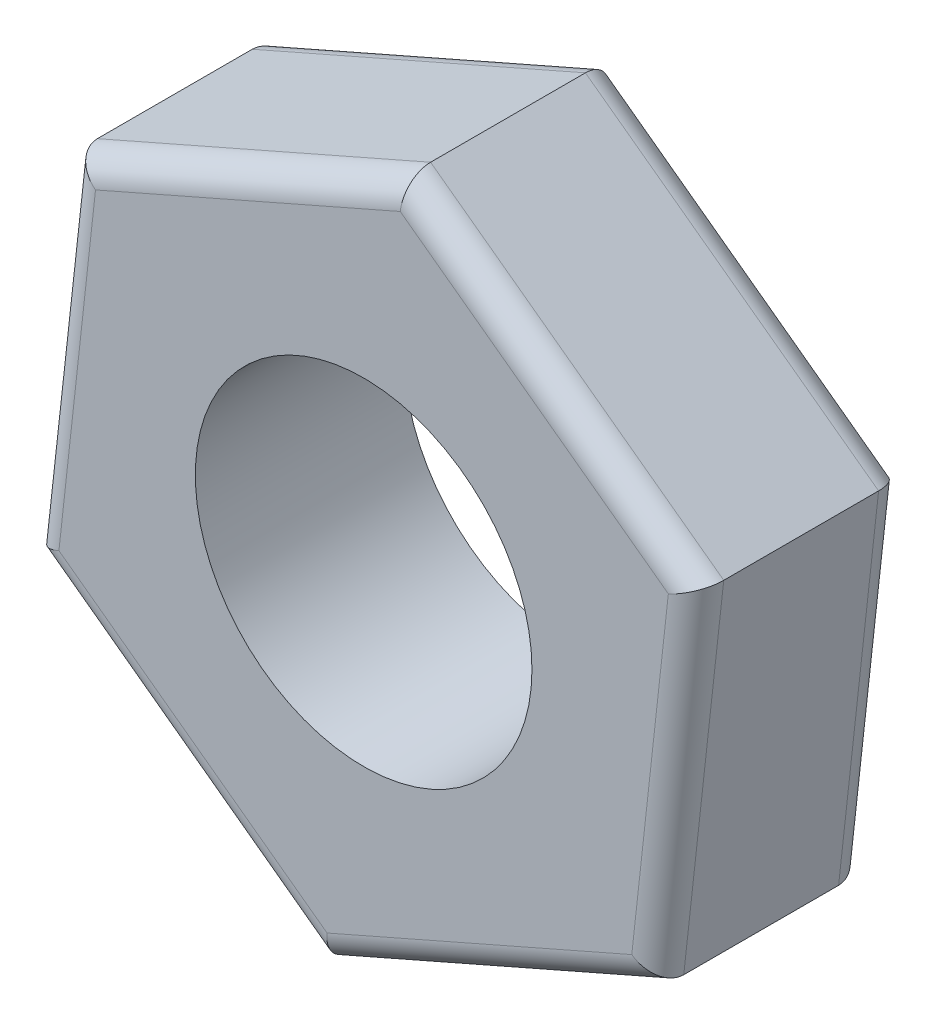
ISO-10303-21;
HEADER;
FILE_DESCRIPTION(('STEP AP214'),'2;1');
FILE_NAME('part.step','',(''),(''),'','','');
FILE_SCHEMA(('AUTOMOTIVE_DESIGN { 1 0 10303 214 1 1 1 1 }'));
ENDSEC;
DATA;
#1=APPLICATION_CONTEXT('core data for automotive mechanical design processes');
#2=APPLICATION_PROTOCOL_DEFINITION('international standard','automotive_design',2000,#1);
#3=PRODUCT_CONTEXT('',#1,'mechanical');
#4=PRODUCT('Part','Part','',(#3));
#5=PRODUCT_RELATED_PRODUCT_CATEGORY('part','',(#4));
#6=PRODUCT_DEFINITION_FORMATION('','',#4);
#7=PRODUCT_DEFINITION_CONTEXT('part definition',#1,'design');
#8=PRODUCT_DEFINITION('design','',#6,#7);
#9=PRODUCT_DEFINITION_SHAPE('','',#8);
#10=(LENGTH_UNIT() NAMED_UNIT(*) SI_UNIT(.MILLI.,.METRE.));
#11=(NAMED_UNIT(*) PLANE_ANGLE_UNIT() SI_UNIT($,.RADIAN.));
#12=(NAMED_UNIT(*) SI_UNIT($,.STERADIAN.) SOLID_ANGLE_UNIT());
#13=UNCERTAINTY_MEASURE_WITH_UNIT(LENGTH_MEASURE(1.E-05),#10,'distance_accuracy_value','');
#14=(GEOMETRIC_REPRESENTATION_CONTEXT(3) GLOBAL_UNCERTAINTY_ASSIGNED_CONTEXT((#13)) GLOBAL_UNIT_ASSIGNED_CONTEXT((#10,
#11,#12)) REPRESENTATION_CONTEXT('',''));
#15=CARTESIAN_POINT('',(0.,0.,0.));
#16=DIRECTION('',(0.,0.,1.));
#17=DIRECTION('',(1.,0.,0.));
#18=AXIS2_PLACEMENT_3D('',#15,#16,#17);
#19=CARTESIAN_POINT('',(2.47437416199614,1.08548261452954,1.55));
#20=DIRECTION('',(-0.592202077659247,-0.805789488151882,0.));
#21=DIRECTION('',(0.805789488151882,-0.592202077659247,0.));
#22=AXIS2_PLACEMENT_3D('',#19,#20,#21);
#23=PLANE('',#22);
#24=DIRECTION('',(0.,0.,-1.));
#25=VECTOR('',#24,1.);
#26=CARTESIAN_POINT('',(2.47437416199614,1.08548261452954,1.55));
#27=LINE('',#26,#25);
#28=CARTESIAN_POINT('',(2.47437416199614,1.08548261452954,1.35));
#29=VERTEX_POINT('',#28);
#30=CARTESIAN_POINT('',(2.47437416199614,1.08548261452954,0.200000000000001));
#31=VERTEX_POINT('',#30);
#32=EDGE_CURVE('E220',#29,#31,#27,.T.);
#33=ORIENTED_EDGE('',*,*,#32,.T.);
#34=DIRECTION('',(-0.805789488151882,0.592202077659247,0.));
#35=VECTOR('',#34,1.);
#36=CARTESIAN_POINT('',(2.47437416199614,1.08548261452954,0.2));
#37=LINE('',#36,#35);
#38=CARTESIAN_POINT('',(0.297131561449135,2.68561219002126,0.200000000000001));
#39=VERTEX_POINT('',#38);
#40=EDGE_CURVE('E189',#31,#39,#37,.T.);
#41=ORIENTED_EDGE('',*,*,#40,.T.);
#42=DIRECTION('',(0.,0.,-1.));
#43=VECTOR('',#42,1.);
#44=CARTESIAN_POINT('',(0.297131561449135,2.68561219002126,1.55));
#45=LINE('',#44,#43);
#46=CARTESIAN_POINT('',(0.297131561449135,2.68561219002126,1.35));
#47=VERTEX_POINT('',#46);
#48=EDGE_CURVE('E141',#47,#39,#45,.T.);
#49=ORIENTED_EDGE('',*,*,#48,.F.);
#50=DIRECTION('',(-0.805789488151882,0.592202077659247,0.));
#51=VECTOR('',#50,1.);
#52=CARTESIAN_POINT('',(2.47437416199614,1.08548261452954,1.35));
#53=LINE('',#52,#51);
#54=EDGE_CURVE('E187',#47,#29,#53,.F.);
#55=ORIENTED_EDGE('',*,*,#54,.T.);
#56=EDGE_LOOP('',(#33,#41,#49,#55));
#57=FACE_BOUND('',#56,.T.);
#58=ADVANCED_FACE('F34',(#57),#23,.F.);
#59=CARTESIAN_POINT('',(0.297131561449135,2.68561219002126,1.55));
#60=DIRECTION('',(0.401733128012366,-0.915756787502774,0.));
#61=DIRECTION('',(0.915756787502774,0.401733128012366,0.));
#62=AXIS2_PLACEMENT_3D('',#59,#60,#61);
#63=PLANE('',#62);
#64=ORIENTED_EDGE('',*,*,#48,.T.);
#65=DIRECTION('',(-0.915756787502774,-0.401733128012366,0.));
#66=VECTOR('',#65,1.);
#67=CARTESIAN_POINT('',(0.297131561449135,2.68561219002126,0.2));
#68=LINE('',#67,#66);
#69=CARTESIAN_POINT('',(-2.17724260054701,1.60012957549172,0.200000000000001));
#70=VERTEX_POINT('',#69);
#71=EDGE_CURVE('E151',#39,#70,#68,.T.);
#72=ORIENTED_EDGE('',*,*,#71,.T.);
#73=DIRECTION('',(0.,0.,-1.));
#74=VECTOR('',#73,1.);
#75=CARTESIAN_POINT('',(-2.17724260054701,1.60012957549172,1.55));
#76=LINE('',#75,#74);
#77=CARTESIAN_POINT('',(-2.17724260054701,1.60012957549172,1.35));
#78=VERTEX_POINT('',#77);
#79=EDGE_CURVE('E156',#78,#70,#76,.T.);
#80=ORIENTED_EDGE('',*,*,#79,.F.);
#81=DIRECTION('',(-0.915756787502774,-0.401733128012366,0.));
#82=VECTOR('',#81,1.);
#83=CARTESIAN_POINT('',(0.297131561449136,2.68561219002126,1.35));
#84=LINE('',#83,#82);
#85=EDGE_CURVE('E191',#78,#47,#84,.F.);
#86=ORIENTED_EDGE('',*,*,#85,.T.);
#87=EDGE_LOOP('',(#64,#72,#80,#86));
#88=FACE_BOUND('',#87,.T.);
#89=ADVANCED_FACE('F275',(#88),#63,.F.);
#90=CARTESIAN_POINT('',(-2.17724260054701,1.60012957549172,1.55));
#91=DIRECTION('',(0.993935205671613,-0.109967299350892,0.));
#92=DIRECTION('',(0.109967299350892,0.993935205671613,0.));
#93=AXIS2_PLACEMENT_3D('',#90,#91,#92);
#94=PLANE('',#93);
#95=ORIENTED_EDGE('',*,*,#79,.T.);
#96=DIRECTION('',(-0.109967299350892,-0.993935205671613,0.));
#97=VECTOR('',#96,1.);
#98=CARTESIAN_POINT('',(-2.17724260054701,1.60012957549172,0.2));
#99=LINE('',#98,#97);
#100=CARTESIAN_POINT('',(-2.47437416199614,-1.08548261452954,0.200000000000001));
#101=VERTEX_POINT('',#100);
#102=EDGE_CURVE('E140',#70,#101,#99,.T.);
#103=ORIENTED_EDGE('',*,*,#102,.T.);
#104=DIRECTION('',(0.,0.,-1.));
#105=VECTOR('',#104,1.);
#106=CARTESIAN_POINT('',(-2.47437416199614,-1.08548261452954,1.55));
#107=LINE('',#106,#105);
#108=CARTESIAN_POINT('',(-2.47437416199614,-1.08548261452954,1.35));
#109=VERTEX_POINT('',#108);
#110=EDGE_CURVE('E147',#109,#101,#107,.T.);
#111=ORIENTED_EDGE('',*,*,#110,.F.);
#112=DIRECTION('',(-0.109967299350892,-0.993935205671613,0.));
#113=VECTOR('',#112,1.);
#114=CARTESIAN_POINT('',(-2.17724260054701,1.60012957549172,1.35));
#115=LINE('',#114,#113);
#116=EDGE_CURVE('E132',#109,#78,#115,.F.);
#117=ORIENTED_EDGE('',*,*,#116,.T.);
#118=EDGE_LOOP('',(#95,#103,#111,#117));
#119=FACE_BOUND('',#118,.T.);
#120=ADVANCED_FACE('F154',(#119),#94,.F.);
#121=CARTESIAN_POINT('',(-2.47437416199614,-1.08548261452954,1.55));
#122=DIRECTION('',(0.592202077659247,0.805789488151882,0.));
#123=DIRECTION('',(-0.805789488151882,0.592202077659247,0.));
#124=AXIS2_PLACEMENT_3D('',#121,#122,#123);
#125=PLANE('',#124);
#126=ORIENTED_EDGE('',*,*,#110,.T.);
#127=DIRECTION('',(0.805789488151882,-0.592202077659247,0.));
#128=VECTOR('',#127,1.);
#129=CARTESIAN_POINT('',(-2.47437416199614,-1.08548261452954,0.2));
#130=LINE('',#129,#128);
#131=CARTESIAN_POINT('',(-0.297131561449133,-2.68561219002126,0.200000000000001));
#132=VERTEX_POINT('',#131);
#133=EDGE_CURVE('E150',#101,#132,#130,.T.);
#134=ORIENTED_EDGE('',*,*,#133,.T.);
#135=DIRECTION('',(0.,0.,-1.));
#136=VECTOR('',#135,1.);
#137=CARTESIAN_POINT('',(-0.297131561449133,-2.68561219002126,1.55));
#138=LINE('',#137,#136);
#139=CARTESIAN_POINT('',(-0.297131561449133,-2.68561219002126,1.35));
#140=VERTEX_POINT('',#139);
#141=EDGE_CURVE('E149',#140,#132,#138,.T.);
#142=ORIENTED_EDGE('',*,*,#141,.F.);
#143=DIRECTION('',(0.805789488151882,-0.592202077659247,0.));
#144=VECTOR('',#143,1.);
#145=CARTESIAN_POINT('',(-2.47437416199614,-1.08548261452954,1.35));
#146=LINE('',#145,#144);
#147=EDGE_CURVE('E127',#140,#109,#146,.F.);
#148=ORIENTED_EDGE('',*,*,#147,.T.);
#149=EDGE_LOOP('',(#126,#134,#142,#148));
#150=FACE_BOUND('',#149,.T.);
#151=ADVANCED_FACE('F146',(#150),#125,.F.);
#152=CARTESIAN_POINT('',(-0.297131561449133,-2.68561219002126,1.55));
#153=DIRECTION('',(-0.401733128012366,0.915756787502773,0.));
#154=DIRECTION('',(-0.915756787502774,-0.401733128012366,0.));
#155=AXIS2_PLACEMENT_3D('',#152,#153,#154);
#156=PLANE('',#155);
#157=ORIENTED_EDGE('',*,*,#141,.T.);
#158=DIRECTION('',(0.915756787502774,0.401733128012366,0.));
#159=VECTOR('',#158,1.);
#160=CARTESIAN_POINT('',(-0.297131561449133,-2.68561219002126,0.2));
#161=LINE('',#160,#159);
#162=CARTESIAN_POINT('',(2.17724260054701,-1.60012957549172,0.200000000000001));
#163=VERTEX_POINT('',#162);
#164=EDGE_CURVE('E181',#132,#163,#161,.T.);
#165=ORIENTED_EDGE('',*,*,#164,.T.);
#166=DIRECTION('',(0.,0.,-1.));
#167=VECTOR('',#166,1.);
#168=CARTESIAN_POINT('',(2.17724260054701,-1.60012957549172,1.55));
#169=LINE('',#168,#167);
#170=CARTESIAN_POINT('',(2.17724260054701,-1.60012957549172,1.35));
#171=VERTEX_POINT('',#170);
#172=EDGE_CURVE('E159',#171,#163,#169,.T.);
#173=ORIENTED_EDGE('',*,*,#172,.F.);
#174=DIRECTION('',(0.915756787502774,0.401733128012366,0.));
#175=VECTOR('',#174,1.);
#176=CARTESIAN_POINT('',(-0.297131561449133,-2.68561219002126,1.35));
#177=LINE('',#176,#175);
#178=EDGE_CURVE('E179',#171,#140,#177,.F.);
#179=ORIENTED_EDGE('',*,*,#178,.T.);
#180=EDGE_LOOP('',(#157,#165,#173,#179));
#181=FACE_BOUND('',#180,.T.);
#182=ADVANCED_FACE('F271',(#181),#156,.F.);
#183=CARTESIAN_POINT('',(2.17724260054701,-1.60012957549172,1.55));
#184=DIRECTION('',(-0.993935205671613,0.109967299350892,0.));
#185=DIRECTION('',(-0.109967299350892,-0.993935205671613,0.));
#186=AXIS2_PLACEMENT_3D('',#183,#184,#185);
#187=PLANE('',#186);
#188=ORIENTED_EDGE('',*,*,#172,.T.);
#189=DIRECTION('',(0.109967299350892,0.993935205671613,0.));
#190=VECTOR('',#189,1.);
#191=CARTESIAN_POINT('',(2.17724260054701,-1.60012957549172,0.2));
#192=LINE('',#191,#190);
#193=EDGE_CURVE('E185',#163,#31,#192,.T.);
#194=ORIENTED_EDGE('',*,*,#193,.T.);
#195=ORIENTED_EDGE('',*,*,#32,.F.);
#196=DIRECTION('',(0.109967299350892,0.993935205671613,0.));
#197=VECTOR('',#196,1.);
#198=CARTESIAN_POINT('',(2.17724260054701,-1.60012957549172,1.35));
#199=LINE('',#198,#197);
#200=EDGE_CURVE('E183',#29,#171,#199,.F.);
#201=ORIENTED_EDGE('',*,*,#200,.T.);
#202=EDGE_LOOP('',(#188,#194,#195,#201));
#203=FACE_BOUND('',#202,.T.);
#204=ADVANCED_FACE('F247',(#203),#187,.F.);
#205=CARTESIAN_POINT('',(0.,0.,1.55));
#206=DIRECTION('',(0.,0.,1.));
#207=DIRECTION('',(1.,0.,0.));
#208=AXIS2_PLACEMENT_3D('',#205,#206,#207);
#209=PLANE('',#208);
#210=CARTESIAN_POINT('',(0.,0.,1.55));
#211=DIRECTION('',(0.,0.,1.));
#212=DIRECTION('',(1.,0.,0.));
#213=AXIS2_PLACEMENT_3D('',#210,#211,#212);
#214=CIRCLE('',#213,1.24999999999999);
#215=CARTESIAN_POINT('',(1.24999999999999,0.,1.55));
#216=VERTEX_POINT('',#215);
#217=EDGE_CURVE('E254',#216,#216,#214,.T.);
#218=ORIENTED_EDGE('',*,*,#217,.F.);
#219=EDGE_LOOP('',(#218));
#220=FACE_BOUND('',#219,.T.);
#221=DIRECTION('',(-0.109967299350892,-0.993935205671613,0.));
#222=VECTOR('',#221,1.);
#223=CARTESIAN_POINT('',(-2.27558712086182,-1.10747607439972,1.55));
#224=LINE('',#223,#222);
#225=CARTESIAN_POINT('',(-1.99115348938914,1.46336636391123,1.55));
#226=VERTEX_POINT('',#225);
#227=CARTESIAN_POINT('',(-2.26288919088536,-0.992706322689411,1.55));
#228=VERTEX_POINT('',#227);
#229=EDGE_CURVE('E43',#226,#228,#224,.T.);
#230=ORIENTED_EDGE('',*,*,#229,.T.);
#231=DIRECTION('',(0.805789488151882,-0.592202077659247,0.));
#232=VECTOR('',#231,1.);
#233=CARTESIAN_POINT('',(-0.178691145917283,-2.52445429239089,1.55));
#234=LINE('',#233,#232);
#235=CARTESIAN_POINT('',(-0.271735701496215,-2.45607268660064,1.55));
#236=VERTEX_POINT('',#235);
#237=EDGE_CURVE('E11',#228,#236,#234,.T.);
#238=ORIENTED_EDGE('',*,*,#237,.T.);
#239=DIRECTION('',(0.915756787502774,0.401733128012366,0.));
#240=VECTOR('',#239,1.);
#241=CARTESIAN_POINT('',(2.09689597494453,-1.41697821799116,1.55));
#242=LINE('',#241,#240);
#243=CARTESIAN_POINT('',(1.99115348938914,-1.46336636391123,1.55));
#244=VERTEX_POINT('',#243);
#245=EDGE_CURVE('E201',#236,#244,#242,.T.);
#246=ORIENTED_EDGE('',*,*,#245,.T.);
#247=DIRECTION('',(0.109967299350892,0.993935205671613,0.));
#248=VECTOR('',#247,1.);
#249=CARTESIAN_POINT('',(2.27558712086182,1.10747607439972,1.55));
#250=LINE('',#249,#248);
#251=CARTESIAN_POINT('',(2.26288919088536,0.992706322689412,1.55));
#252=VERTEX_POINT('',#251);
#253=EDGE_CURVE('E199',#244,#252,#250,.T.);
#254=ORIENTED_EDGE('',*,*,#253,.T.);
#255=DIRECTION('',(-0.805789488151882,0.592202077659247,0.));
#256=VECTOR('',#255,1.);
#257=CARTESIAN_POINT('',(0.178691145917285,2.52445429239089,1.55));
#258=LINE('',#257,#256);
#259=CARTESIAN_POINT('',(0.271735701496217,2.45607268660064,1.55));
#260=VERTEX_POINT('',#259);
#261=EDGE_CURVE('E197',#252,#260,#258,.T.);
#262=ORIENTED_EDGE('',*,*,#261,.T.);
#263=DIRECTION('',(-0.915756787502774,-0.401733128012366,0.));
#264=VECTOR('',#263,1.);
#265=CARTESIAN_POINT('',(-2.09689597494453,1.41697821799116,1.55));
#266=LINE('',#265,#264);
#267=EDGE_CURVE('E195',#260,#226,#266,.T.);
#268=ORIENTED_EDGE('',*,*,#267,.T.);
#269=EDGE_LOOP('',(#230,#238,#246,#254,#262,#268));
#270=FACE_BOUND('',#269,.T.);
#271=ADVANCED_FACE('F260',(#220,#270),#209,.T.);
#272=CARTESIAN_POINT('',(0.,0.,0.));
#273=DIRECTION('',(0.,0.,1.));
#274=DIRECTION('',(1.,0.,0.));
#275=AXIS2_PLACEMENT_3D('',#272,#273,#274);
#276=PLANE('',#275);
#277=CARTESIAN_POINT('',(0.,0.,0.));
#278=DIRECTION('',(0.,0.,1.));
#279=DIRECTION('',(1.,0.,0.));
#280=AXIS2_PLACEMENT_3D('',#277,#278,#279);
#281=CIRCLE('',#280,1.25);
#282=CARTESIAN_POINT('',(1.25,0.,0.));
#283=VERTEX_POINT('',#282);
#284=EDGE_CURVE('E221',#283,#283,#281,.T.);
#285=ORIENTED_EDGE('',*,*,#284,.T.);
#286=EDGE_LOOP('',(#285));
#287=FACE_BOUND('',#286,.T.);
#288=DIRECTION('',(-0.805789488151882,0.592202077659247,0.));
#289=VECTOR('',#288,1.);
#290=CARTESIAN_POINT('',(1.26731244619079,1.72438950464503,0.));
#291=LINE('',#290,#289);
#292=CARTESIAN_POINT('',(0.271735701496217,2.45607268660064,0.));
#293=VERTEX_POINT('',#292);
#294=CARTESIAN_POINT('',(2.26288919088536,0.992706322689412,0.));
#295=VERTEX_POINT('',#294);
#296=EDGE_CURVE('E175',#293,#295,#291,.F.);
#297=ORIENTED_EDGE('',*,*,#296,.T.);
#298=DIRECTION('',(0.109967299350892,0.993935205671613,0.));
#299=VECTOR('',#298,1.);
#300=CARTESIAN_POINT('',(2.12702134013725,-0.235330020610909,0.));
#301=LINE('',#300,#299);
#302=CARTESIAN_POINT('',(1.99115348938914,-1.46336636391123,0.));
#303=VERTEX_POINT('',#302);
#304=EDGE_CURVE('E177',#295,#303,#301,.F.);
#305=ORIENTED_EDGE('',*,*,#304,.T.);
#306=DIRECTION('',(0.915756787502774,0.401733128012366,0.));
#307=VECTOR('',#306,1.);
#308=CARTESIAN_POINT('',(0.859708893946464,-1.95971952525594,0.));
#309=LINE('',#308,#307);
#310=CARTESIAN_POINT('',(-0.271735701496215,-2.45607268660064,0.));
#311=VERTEX_POINT('',#310);
#312=EDGE_CURVE('E168',#303,#311,#309,.F.);
#313=ORIENTED_EDGE('',*,*,#312,.T.);
#314=DIRECTION('',(0.805789488151882,-0.592202077659247,0.));
#315=VECTOR('',#314,1.);
#316=CARTESIAN_POINT('',(-1.26731244619079,-1.72438950464503,0.));
#317=LINE('',#316,#315);
#318=CARTESIAN_POINT('',(-2.26288919088536,-0.992706322689411,0.));
#319=VERTEX_POINT('',#318);
#320=EDGE_CURVE('E166',#311,#319,#317,.F.);
#321=ORIENTED_EDGE('',*,*,#320,.T.);
#322=DIRECTION('',(-0.109967299350892,-0.993935205671613,0.));
#323=VECTOR('',#322,1.);
#324=CARTESIAN_POINT('',(-2.12702134013725,0.235330020610909,0.));
#325=LINE('',#324,#323);
#326=CARTESIAN_POINT('',(-1.99115348938914,1.46336636391123,0.));
#327=VERTEX_POINT('',#326);
#328=EDGE_CURVE('E170',#319,#327,#325,.F.);
#329=ORIENTED_EDGE('',*,*,#328,.T.);
#330=DIRECTION('',(-0.915756787502774,-0.401733128012366,0.));
#331=VECTOR('',#330,1.);
#332=CARTESIAN_POINT('',(-0.859708893946462,1.95971952525594,0.));
#333=LINE('',#332,#331);
#334=EDGE_CURVE('E173',#327,#293,#333,.F.);
#335=ORIENTED_EDGE('',*,*,#334,.T.);
#336=EDGE_LOOP('',(#297,#305,#313,#321,#329,#335));
#337=FACE_BOUND('',#336,.T.);
#338=ADVANCED_FACE('F262',(#287,#337),#276,.F.);
#339=CARTESIAN_POINT('',(1.97845555941268,-1.57813611562154,0.2));
#340=DIRECTION('',(0.109967299350892,0.993935205671613,0.));
#341=DIRECTION('',(-0.993935205671613,0.109967299350892,0.));
#342=AXIS2_PLACEMENT_3D('',#339,#340,#341);
#343=CYLINDRICAL_SURFACE('',#342,0.2);
#344=CARTESIAN_POINT('',(1.99115348938914,-1.46336636391123,0.2));
#345=DIRECTION('',(0.592202077659247,0.805789488151882,0.));
#346=DIRECTION('',(-0.805789488151882,0.592202077659247,0.));
#347=AXIS2_PLACEMENT_3D('',#344,#345,#346);
#348=ELLIPSE('',#347,0.23094010767585,0.2);
#349=EDGE_CURVE('E214',#303,#163,#348,.F.);
#350=ORIENTED_EDGE('',*,*,#349,.F.);
#351=ORIENTED_EDGE('',*,*,#304,.F.);
#352=CARTESIAN_POINT('',(2.26288919088536,0.992706322689412,0.2));
#353=DIRECTION('',(-0.401733128012366,0.915756787502774,0.));
#354=DIRECTION('',(-0.915756787502774,-0.401733128012366,0.));
#355=AXIS2_PLACEMENT_3D('',#352,#353,#354);
#356=ELLIPSE('',#355,0.23094010767585,0.2);
#357=EDGE_CURVE('E217',#31,#295,#356,.T.);
#358=ORIENTED_EDGE('',*,*,#357,.F.);
#359=ORIENTED_EDGE('',*,*,#193,.F.);
#360=EDGE_LOOP('',(#350,#351,#358,#359));
#361=FACE_BOUND('',#360,.T.);
#362=ADVANCED_FACE('F268',(#361),#343,.T.);
#363=CARTESIAN_POINT('',(2.35593374646429,0.924324716899167,0.2));
#364=DIRECTION('',(-0.805789488151882,0.592202077659247,0.));
#365=DIRECTION('',(-0.592202077659247,-0.805789488151882,0.));
#366=AXIS2_PLACEMENT_3D('',#363,#364,#365);
#367=CYLINDRICAL_SURFACE('',#366,0.2);
#368=ORIENTED_EDGE('',*,*,#357,.T.);
#369=ORIENTED_EDGE('',*,*,#296,.F.);
#370=CARTESIAN_POINT('',(0.271735701496216,2.45607268660064,0.2));
#371=DIRECTION('',(-0.993935205671613,0.109967299350892,0.));
#372=DIRECTION('',(-0.109967299350892,-0.993935205671613,0.));
#373=AXIS2_PLACEMENT_3D('',#370,#371,#372);
#374=ELLIPSE('',#373,0.23094010767585,0.2);
#375=EDGE_CURVE('E211',#39,#293,#374,.T.);
#376=ORIENTED_EDGE('',*,*,#375,.F.);
#377=ORIENTED_EDGE('',*,*,#40,.F.);
#378=EDGE_LOOP('',(#368,#369,#376,#377));
#379=FACE_BOUND('',#378,.T.);
#380=ADVANCED_FACE('F299',(#379),#367,.T.);
#381=CARTESIAN_POINT('',(-0.377478187051606,-2.50246083252071,0.2));
#382=DIRECTION('',(0.915756787502774,0.401733128012366,0.));
#383=DIRECTION('',(-0.401733128012366,0.915756787502774,0.));
#384=AXIS2_PLACEMENT_3D('',#381,#382,#383);
#385=CYLINDRICAL_SURFACE('',#384,0.2);
#386=ORIENTED_EDGE('',*,*,#349,.T.);
#387=ORIENTED_EDGE('',*,*,#164,.F.);
#388=CARTESIAN_POINT('',(-0.271735701496216,-2.45607268660064,0.2));
#389=DIRECTION('',(0.993935205671613,-0.109967299350892,0.));
#390=DIRECTION('',(-0.109967299350892,-0.993935205671613,0.));
#391=AXIS2_PLACEMENT_3D('',#388,#389,#390);
#392=ELLIPSE('',#391,0.23094010767585,0.2);
#393=EDGE_CURVE('E208',#311,#132,#392,.F.);
#394=ORIENTED_EDGE('',*,*,#393,.F.);
#395=ORIENTED_EDGE('',*,*,#312,.F.);
#396=EDGE_LOOP('',(#386,#387,#394,#395));
#397=FACE_BOUND('',#396,.T.);
#398=ADVANCED_FACE('F295',(#397),#385,.T.);
#399=CARTESIAN_POINT('',(0.377478187051608,2.50246083252071,0.2));
#400=DIRECTION('',(-0.915756787502774,-0.401733128012366,0.));
#401=DIRECTION('',(0.401733128012366,-0.915756787502774,0.));
#402=AXIS2_PLACEMENT_3D('',#399,#400,#401);
#403=CYLINDRICAL_SURFACE('',#402,0.2);
#404=ORIENTED_EDGE('',*,*,#375,.T.);
#405=ORIENTED_EDGE('',*,*,#334,.F.);
#406=CARTESIAN_POINT('',(-1.99115348938914,1.46336636391123,0.2));
#407=DIRECTION('',(-0.592202077659247,-0.805789488151881,0.));
#408=DIRECTION('',(-0.805789488151882,0.592202077659247,0.));
#409=AXIS2_PLACEMENT_3D('',#406,#407,#408);
#410=ELLIPSE('',#409,0.23094010767585,0.2);
#411=EDGE_CURVE('E206',#70,#327,#410,.T.);
#412=ORIENTED_EDGE('',*,*,#411,.F.);
#413=ORIENTED_EDGE('',*,*,#71,.F.);
#414=EDGE_LOOP('',(#404,#405,#412,#413));
#415=FACE_BOUND('',#414,.T.);
#416=ADVANCED_FACE('F291',(#415),#403,.T.);
#417=CARTESIAN_POINT('',(-2.35593374646429,-0.924324716899167,0.2));
#418=DIRECTION('',(0.805789488151882,-0.592202077659247,0.));
#419=DIRECTION('',(0.592202077659247,0.805789488151882,0.));
#420=AXIS2_PLACEMENT_3D('',#417,#418,#419);
#421=CYLINDRICAL_SURFACE('',#420,0.2);
#422=ORIENTED_EDGE('',*,*,#393,.T.);
#423=ORIENTED_EDGE('',*,*,#133,.F.);
#424=CARTESIAN_POINT('',(-2.26288919088536,-0.992706322689412,0.2));
#425=DIRECTION('',(0.401733128012366,-0.915756787502774,0.));
#426=DIRECTION('',(0.915756787502773,0.401733128012366,0.));
#427=AXIS2_PLACEMENT_3D('',#424,#425,#426);
#428=ELLIPSE('',#427,0.23094010767585,0.2);
#429=EDGE_CURVE('E204',#319,#101,#428,.F.);
#430=ORIENTED_EDGE('',*,*,#429,.F.);
#431=ORIENTED_EDGE('',*,*,#320,.F.);
#432=EDGE_LOOP('',(#422,#423,#430,#431));
#433=FACE_BOUND('',#432,.T.);
#434=ADVANCED_FACE('F287',(#433),#421,.T.);
#435=CARTESIAN_POINT('',(-1.97845555941268,1.57813611562154,0.2));
#436=DIRECTION('',(-0.109967299350892,-0.993935205671613,0.));
#437=DIRECTION('',(0.993935205671613,-0.109967299350892,0.));
#438=AXIS2_PLACEMENT_3D('',#435,#436,#437);
#439=CYLINDRICAL_SURFACE('',#438,0.2);
#440=ORIENTED_EDGE('',*,*,#411,.T.);
#441=ORIENTED_EDGE('',*,*,#328,.F.);
#442=ORIENTED_EDGE('',*,*,#429,.T.);
#443=ORIENTED_EDGE('',*,*,#102,.F.);
#444=EDGE_LOOP('',(#440,#441,#442,#443));
#445=FACE_BOUND('',#444,.T.);
#446=ADVANCED_FACE('F284',(#445),#439,.T.);
#447=CARTESIAN_POINT('',(1.26731244619079,1.72438950464503,1.35));
#448=DIRECTION('',(0.805789488151882,-0.592202077659247,0.));
#449=DIRECTION('',(0.592202077659247,0.805789488151882,0.));
#450=AXIS2_PLACEMENT_3D('',#447,#448,#449);
#451=CYLINDRICAL_SURFACE('',#450,0.2);
#452=CARTESIAN_POINT('',(2.26288919088536,0.992706322689413,1.35));
#453=DIRECTION('',(0.401733128012366,-0.915756787502774,0.));
#454=DIRECTION('',(0.915756787502774,0.401733128012366,0.));
#455=AXIS2_PLACEMENT_3D('',#452,#453,#454);
#456=ELLIPSE('',#455,0.23094010767585,0.2);
#457=EDGE_CURVE('E225',#29,#252,#456,.T.);
#458=ORIENTED_EDGE('',*,*,#457,.F.);
#459=ORIENTED_EDGE('',*,*,#54,.F.);
#460=CARTESIAN_POINT('',(0.271735701496216,2.45607268660064,1.35));
#461=DIRECTION('',(0.993935205671613,-0.109967299350892,0.));
#462=DIRECTION('',(0.109967299350892,0.993935205671613,0.));
#463=AXIS2_PLACEMENT_3D('',#460,#461,#462);
#464=ELLIPSE('',#463,0.23094010767585,0.2);
#465=EDGE_CURVE('E38',#260,#47,#464,.F.);
#466=ORIENTED_EDGE('',*,*,#465,.F.);
#467=ORIENTED_EDGE('',*,*,#261,.F.);
#468=EDGE_LOOP('',(#458,#459,#466,#467));
#469=FACE_BOUND('',#468,.T.);
#470=ADVANCED_FACE('F36',(#469),#451,.T.);
#471=CARTESIAN_POINT('',(-0.859708893946462,1.95971952525594,1.35));
#472=DIRECTION('',(0.915756787502774,0.401733128012366,0.));
#473=DIRECTION('',(-0.401733128012366,0.915756787502774,0.));
#474=AXIS2_PLACEMENT_3D('',#471,#472,#473);
#475=CYLINDRICAL_SURFACE('',#474,0.2);
#476=ORIENTED_EDGE('',*,*,#465,.T.);
#477=ORIENTED_EDGE('',*,*,#85,.F.);
#478=CARTESIAN_POINT('',(-1.99115348938914,1.46336636391123,1.35));
#479=DIRECTION('',(0.592202077659247,0.805789488151881,0.));
#480=DIRECTION('',(0.805789488151882,-0.592202077659247,0.));
#481=AXIS2_PLACEMENT_3D('',#478,#479,#480);
#482=ELLIPSE('',#481,0.23094010767585,0.2);
#483=EDGE_CURVE('E135',#226,#78,#482,.F.);
#484=ORIENTED_EDGE('',*,*,#483,.F.);
#485=ORIENTED_EDGE('',*,*,#267,.F.);
#486=EDGE_LOOP('',(#476,#477,#484,#485));
#487=FACE_BOUND('',#486,.T.);
#488=ADVANCED_FACE('F236',(#487),#475,.T.);
#489=CARTESIAN_POINT('',(2.12702134013725,-0.235330020610909,1.35));
#490=DIRECTION('',(-0.109967299350892,-0.993935205671613,0.));
#491=DIRECTION('',(0.993935205671613,-0.109967299350892,0.));
#492=AXIS2_PLACEMENT_3D('',#489,#490,#491);
#493=CYLINDRICAL_SURFACE('',#492,0.2);
#494=ORIENTED_EDGE('',*,*,#457,.T.);
#495=ORIENTED_EDGE('',*,*,#253,.F.);
#496=CARTESIAN_POINT('',(1.99115348938914,-1.46336636391123,1.35));
#497=DIRECTION('',(-0.592202077659247,-0.805789488151882,0.));
#498=DIRECTION('',(0.805789488151882,-0.592202077659247,0.));
#499=AXIS2_PLACEMENT_3D('',#496,#497,#498);
#500=ELLIPSE('',#499,0.23094010767585,0.2);
#501=EDGE_CURVE('E129',#171,#244,#500,.T.);
#502=ORIENTED_EDGE('',*,*,#501,.F.);
#503=ORIENTED_EDGE('',*,*,#200,.F.);
#504=EDGE_LOOP('',(#494,#495,#502,#503));
#505=FACE_BOUND('',#504,.T.);
#506=ADVANCED_FACE('F315',(#505),#493,.T.);
#507=CARTESIAN_POINT('',(-2.12702134013725,0.235330020610909,1.35));
#508=DIRECTION('',(0.109967299350892,0.993935205671613,0.));
#509=DIRECTION('',(-0.993935205671613,0.109967299350892,0.));
#510=AXIS2_PLACEMENT_3D('',#507,#508,#509);
#511=CYLINDRICAL_SURFACE('',#510,0.2);
#512=ORIENTED_EDGE('',*,*,#483,.T.);
#513=ORIENTED_EDGE('',*,*,#116,.F.);
#514=CARTESIAN_POINT('',(-2.26288919088536,-0.992706322689411,1.35));
#515=DIRECTION('',(-0.401733128012366,0.915756787502774,0.));
#516=DIRECTION('',(0.915756787502773,0.401733128012366,0.));
#517=AXIS2_PLACEMENT_3D('',#514,#515,#516);
#518=ELLIPSE('',#517,0.23094010767585,0.2);
#519=EDGE_CURVE('E123',#228,#109,#518,.F.);
#520=ORIENTED_EDGE('',*,*,#519,.F.);
#521=ORIENTED_EDGE('',*,*,#229,.F.);
#522=EDGE_LOOP('',(#512,#513,#520,#521));
#523=FACE_BOUND('',#522,.T.);
#524=ADVANCED_FACE('F133',(#523),#511,.T.);
#525=CARTESIAN_POINT('',(0.859708893946463,-1.95971952525594,1.35));
#526=DIRECTION('',(-0.915756787502774,-0.401733128012366,0.));
#527=DIRECTION('',(0.401733128012366,-0.915756787502774,0.));
#528=AXIS2_PLACEMENT_3D('',#525,#526,#527);
#529=CYLINDRICAL_SURFACE('',#528,0.2);
#530=ORIENTED_EDGE('',*,*,#501,.T.);
#531=ORIENTED_EDGE('',*,*,#245,.F.);
#532=CARTESIAN_POINT('',(-0.271735701496215,-2.45607268660064,1.35));
#533=DIRECTION('',(-0.993935205671613,0.109967299350892,0.));
#534=DIRECTION('',(-0.109967299350892,-0.993935205671613,0.));
#535=AXIS2_PLACEMENT_3D('',#532,#533,#534);
#536=ELLIPSE('',#535,0.23094010767585,0.2);
#537=EDGE_CURVE('E57',#140,#236,#536,.T.);
#538=ORIENTED_EDGE('',*,*,#537,.F.);
#539=ORIENTED_EDGE('',*,*,#178,.F.);
#540=EDGE_LOOP('',(#530,#531,#538,#539));
#541=FACE_BOUND('',#540,.T.);
#542=ADVANCED_FACE('F309',(#541),#529,.T.);
#543=CARTESIAN_POINT('',(-1.26731244619079,-1.72438950464503,1.35));
#544=DIRECTION('',(-0.805789488151882,0.592202077659247,0.));
#545=DIRECTION('',(-0.592202077659247,-0.805789488151882,0.));
#546=AXIS2_PLACEMENT_3D('',#543,#544,#545);
#547=CYLINDRICAL_SURFACE('',#546,0.2);
#548=ORIENTED_EDGE('',*,*,#519,.T.);
#549=ORIENTED_EDGE('',*,*,#147,.F.);
#550=ORIENTED_EDGE('',*,*,#537,.T.);
#551=ORIENTED_EDGE('',*,*,#237,.F.);
#552=EDGE_LOOP('',(#548,#549,#550,#551));
#553=FACE_BOUND('',#552,.T.);
#554=ADVANCED_FACE('F125',(#553),#547,.T.);
#555=CARTESIAN_POINT('',(0.,0.,1.55));
#556=DIRECTION('',(0.,0.,1.));
#557=DIRECTION('',(1.,0.,0.));
#558=AXIS2_PLACEMENT_3D('',#555,#556,#557);
#559=CYLINDRICAL_SURFACE('',#558,1.24999999999999);
#560=ORIENTED_EDGE('',*,*,#284,.F.);
#561=EDGE_LOOP('',(#560));
#562=FACE_BOUND('',#561,.T.);
#563=ORIENTED_EDGE('',*,*,#217,.T.);
#564=EDGE_LOOP('',(#563));
#565=FACE_BOUND('',#564,.T.);
#566=ADVANCED_FACE('F258',(#562,#565),#559,.F.);
#567=CLOSED_SHELL('',(#58,#89,#120,#151,#182,#204,#271,#338,#362,#380,#398,#416,#434,#446,#470,
#488,#506,#524,#542,#554,#566));
#568=MANIFOLD_SOLID_BREP('B2',#567);
#569=ADVANCED_BREP_SHAPE_REPRESENTATION('',(#18,#568),#14);
#570=SHAPE_DEFINITION_REPRESENTATION(#9,#569);
ENDSEC;
END-ISO-10303-21;
